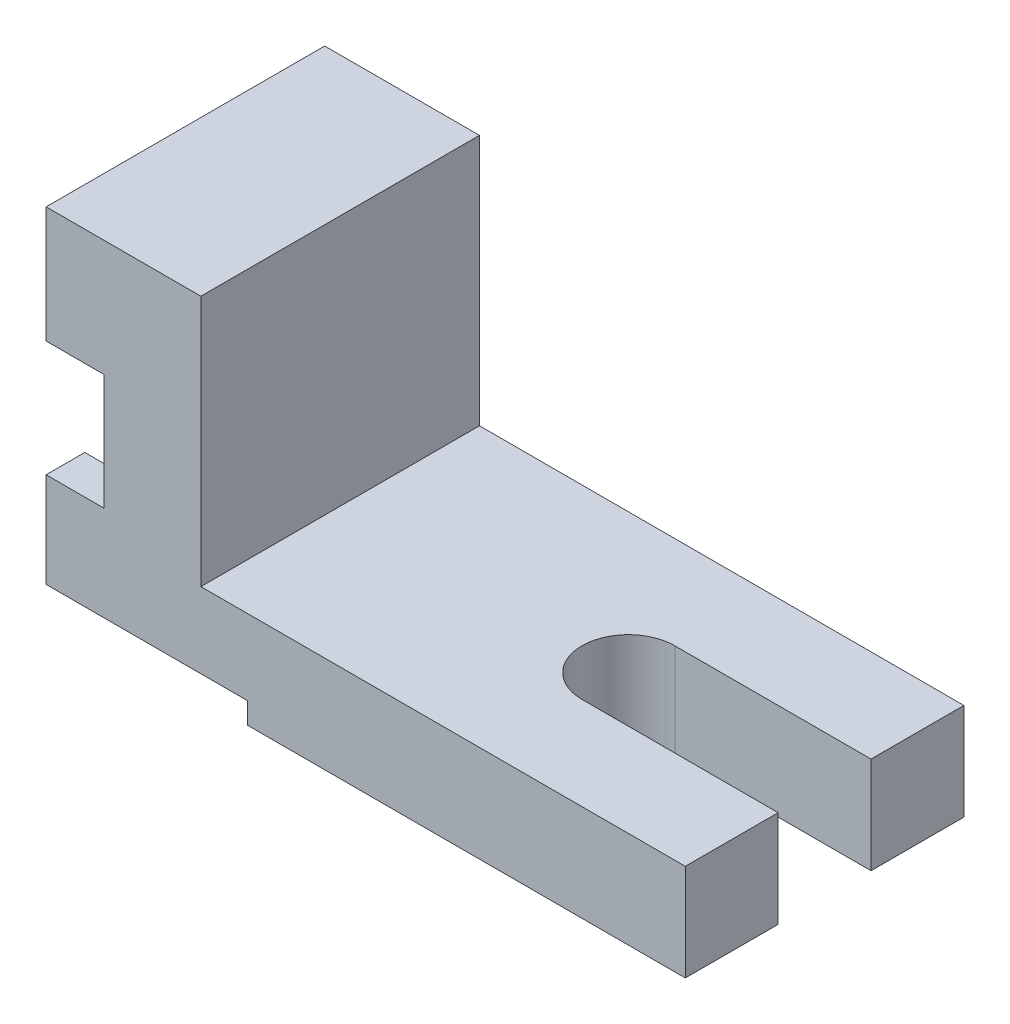
ISO-10303-21;
HEADER;
FILE_DESCRIPTION(('STEP AP214'),'2;1');
FILE_NAME('part.step','',(''),(''),'','','');
FILE_SCHEMA(('AUTOMOTIVE_DESIGN { 1 0 10303 214 1 1 1 1 }'));
ENDSEC;
DATA;
#1=APPLICATION_CONTEXT('core data for automotive mechanical design processes');
#2=APPLICATION_PROTOCOL_DEFINITION('international standard','automotive_design',2000,#1);
#3=PRODUCT_CONTEXT('',#1,'mechanical');
#4=PRODUCT('Part','Part','',(#3));
#5=PRODUCT_RELATED_PRODUCT_CATEGORY('part','',(#4));
#6=PRODUCT_DEFINITION_FORMATION('','',#4);
#7=PRODUCT_DEFINITION_CONTEXT('part definition',#1,'design');
#8=PRODUCT_DEFINITION('design','',#6,#7);
#9=PRODUCT_DEFINITION_SHAPE('','',#8);
#10=(LENGTH_UNIT() NAMED_UNIT(*) SI_UNIT(.MILLI.,.METRE.));
#11=(NAMED_UNIT(*) PLANE_ANGLE_UNIT() SI_UNIT($,.RADIAN.));
#12=(NAMED_UNIT(*) SI_UNIT($,.STERADIAN.) SOLID_ANGLE_UNIT());
#13=UNCERTAINTY_MEASURE_WITH_UNIT(LENGTH_MEASURE(1.E-05),#10,'distance_accuracy_value','');
#14=(GEOMETRIC_REPRESENTATION_CONTEXT(3) GLOBAL_UNCERTAINTY_ASSIGNED_CONTEXT((#13)) GLOBAL_UNIT_ASSIGNED_CONTEXT((#10,
#11,#12)) REPRESENTATION_CONTEXT('',''));
#15=CARTESIAN_POINT('',(0.,0.,0.));
#16=DIRECTION('',(0.,0.,1.));
#17=DIRECTION('',(1.,0.,0.));
#18=AXIS2_PLACEMENT_3D('',#15,#16,#17);
#19=CARTESIAN_POINT('',(-25.,0.,0.));
#20=DIRECTION('',(1.,0.,0.));
#21=DIRECTION('',(0.,0.,-1.));
#22=AXIS2_PLACEMENT_3D('',#19,#20,#21);
#23=PLANE('',#22);
#24=DIRECTION('',(0.,0.,1.));
#25=VECTOR('',#24,1.);
#26=CARTESIAN_POINT('',(-25.,59.9666295470957,-72.));
#27=LINE('',#26,#25);
#28=CARTESIAN_POINT('',(-25.,59.9666295470957,-72.));
#29=VERTEX_POINT('',#28);
#30=CARTESIAN_POINT('',(-25.,59.9666295470957,-62.));
#31=VERTEX_POINT('',#30);
#32=EDGE_CURVE('E255',#29,#31,#27,.T.);
#33=ORIENTED_EDGE('',*,*,#32,.F.);
#34=DIRECTION('',(0.,-1.,0.));
#35=VECTOR('',#34,1.);
#36=CARTESIAN_POINT('',(-25.,0.,-72.));
#37=LINE('',#36,#35);
#38=CARTESIAN_POINT('',(-25.,30.0333704529043,-72.));
#39=VERTEX_POINT('',#38);
#40=EDGE_CURVE('E305',#29,#39,#37,.T.);
#41=ORIENTED_EDGE('',*,*,#40,.T.);
#42=DIRECTION('',(0.,0.,-1.));
#43=VECTOR('',#42,1.);
#44=CARTESIAN_POINT('',(-25.,30.0333704529043,-72.));
#45=LINE('',#44,#43);
#46=CARTESIAN_POINT('',(-25.,30.0333704529043,-62.));
#47=VERTEX_POINT('',#46);
#48=EDGE_CURVE('E224',#47,#39,#45,.T.);
#49=ORIENTED_EDGE('',*,*,#48,.F.);
#50=CARTESIAN_POINT('',(-25.,45.,-36.));
#51=DIRECTION('',(1.,0.,0.));
#52=DIRECTION('',(0.,0.,1.));
#53=AXIS2_PLACEMENT_3D('',#50,#51,#52);
#54=CIRCLE('',#53,30.);
#55=CARTESIAN_POINT('',(-25.,30.0333704529042,-10.));
#56=VERTEX_POINT('',#55);
#57=EDGE_CURVE('E254',#56,#47,#54,.T.);
#58=ORIENTED_EDGE('',*,*,#57,.F.);
#59=DIRECTION('',(0.,0.,-1.));
#60=VECTOR('',#59,1.);
#61=CARTESIAN_POINT('',(-25.,30.0333704529042,0.));
#62=LINE('',#61,#60);
#63=CARTESIAN_POINT('',(-25.,30.0333704529042,0.));
#64=VERTEX_POINT('',#63);
#65=EDGE_CURVE('E250',#64,#56,#62,.T.);
#66=ORIENTED_EDGE('',*,*,#65,.F.);
#67=DIRECTION('',(0.,1.,0.));
#68=VECTOR('',#67,1.);
#69=CARTESIAN_POINT('',(-25.,90.,0.));
#70=LINE('',#69,#68);
#71=CARTESIAN_POINT('',(-25.,59.9666295470957,0.));
#72=VERTEX_POINT('',#71);
#73=EDGE_CURVE('E302',#64,#72,#70,.T.);
#74=ORIENTED_EDGE('',*,*,#73,.T.);
#75=DIRECTION('',(0.,0.,1.));
#76=VECTOR('',#75,1.);
#77=CARTESIAN_POINT('',(-25.,59.9666295470958,0.));
#78=LINE('',#77,#76);
#79=CARTESIAN_POINT('',(-25.,59.9666295470958,-10.));
#80=VERTEX_POINT('',#79);
#81=EDGE_CURVE('E64',#80,#72,#78,.T.);
#82=ORIENTED_EDGE('',*,*,#81,.F.);
#83=CARTESIAN_POINT('',(-25.,45.,-36.));
#84=DIRECTION('',(1.,0.,0.));
#85=DIRECTION('',(0.,0.,1.));
#86=AXIS2_PLACEMENT_3D('',#83,#84,#85);
#87=CIRCLE('',#86,30.);
#88=EDGE_CURVE('E59',#31,#80,#87,.T.);
#89=ORIENTED_EDGE('',*,*,#88,.F.);
#90=EDGE_LOOP('',(#33,#41,#49,#58,#66,#74,#82,#89));
#91=FACE_BOUND('',#90,.T.);
#92=ADVANCED_FACE('F43',(#91),#23,.F.);
#93=CARTESIAN_POINT('',(62.5979381443299,25.,0.));
#94=DIRECTION('',(0.,0.,-1.));
#95=DIRECTION('',(-1.,0.,0.));
#96=AXIS2_PLACEMENT_3D('',#93,#94,#95);
#97=PLANE('',#96);
#98=ORIENTED_EDGE('',*,*,#73,.F.);
#99=DIRECTION('',(1.,0.,0.));
#100=VECTOR('',#99,1.);
#101=CARTESIAN_POINT('',(-40.,30.0333704529042,0.));
#102=LINE('',#101,#100);
#103=CARTESIAN_POINT('',(-40.,30.0333704529042,0.));
#104=VERTEX_POINT('',#103);
#105=EDGE_CURVE('E273',#104,#64,#102,.T.);
#106=ORIENTED_EDGE('',*,*,#105,.F.);
#107=DIRECTION('',(0.,1.,0.));
#108=VECTOR('',#107,1.);
#109=CARTESIAN_POINT('',(-40.,5.48818639733899,0.));
#110=LINE('',#109,#108);
#111=CARTESIAN_POINT('',(-40.,5.48818639733899,0.));
#112=VERTEX_POINT('',#111);
#113=EDGE_CURVE('E219',#112,#104,#110,.T.);
#114=ORIENTED_EDGE('',*,*,#113,.F.);
#115=DIRECTION('',(-1.,0.,0.));
#116=VECTOR('',#115,1.);
#117=CARTESIAN_POINT('',(12.0598958251197,5.48818639733899,0.));
#118=LINE('',#117,#116);
#119=CARTESIAN_POINT('',(12.0598958251197,5.48818639733899,0.));
#120=VERTEX_POINT('',#119);
#121=EDGE_CURVE('E283',#120,#112,#118,.T.);
#122=ORIENTED_EDGE('',*,*,#121,.F.);
#123=DIRECTION('',(0.,1.,0.));
#124=VECTOR('',#123,1.);
#125=CARTESIAN_POINT('',(12.0598958251197,0.,0.));
#126=LINE('',#125,#124);
#127=CARTESIAN_POINT('',(12.0598958251197,0.,0.));
#128=VERTEX_POINT('',#127);
#129=EDGE_CURVE('E277',#128,#120,#126,.T.);
#130=ORIENTED_EDGE('',*,*,#129,.F.);
#131=DIRECTION('',(1.,0.,0.));
#132=VECTOR('',#131,1.);
#133=CARTESIAN_POINT('',(62.5979381443299,0.,0.));
#134=LINE('',#133,#132);
#135=CARTESIAN_POINT('',(125.19587628866,0.,0.));
#136=VERTEX_POINT('',#135);
#137=EDGE_CURVE('E323',#128,#136,#134,.T.);
#138=ORIENTED_EDGE('',*,*,#137,.T.);
#139=DIRECTION('',(0.,-1.,0.));
#140=VECTOR('',#139,1.);
#141=CARTESIAN_POINT('',(125.19587628866,25.,0.));
#142=LINE('',#141,#140);
#143=CARTESIAN_POINT('',(125.19587628866,25.,0.));
#144=VERTEX_POINT('',#143);
#145=EDGE_CURVE('E11',#144,#136,#142,.T.);
#146=ORIENTED_EDGE('',*,*,#145,.F.);
#147=DIRECTION('',(1.,0.,0.));
#148=VECTOR('',#147,1.);
#149=CARTESIAN_POINT('',(0.,25.,0.));
#150=LINE('',#149,#148);
#151=CARTESIAN_POINT('',(0.,25.,0.));
#152=VERTEX_POINT('',#151);
#153=EDGE_CURVE('E328',#152,#144,#150,.T.);
#154=ORIENTED_EDGE('',*,*,#153,.F.);
#155=DIRECTION('',(0.,1.,0.));
#156=VECTOR('',#155,1.);
#157=CARTESIAN_POINT('',(0.,90.,0.));
#158=LINE('',#157,#156);
#159=CARTESIAN_POINT('',(0.,90.,0.));
#160=VERTEX_POINT('',#159);
#161=EDGE_CURVE('E299',#152,#160,#158,.T.);
#162=ORIENTED_EDGE('',*,*,#161,.T.);
#163=DIRECTION('',(1.,0.,0.));
#164=VECTOR('',#163,1.);
#165=CARTESIAN_POINT('',(-25.,90.,0.));
#166=LINE('',#165,#164);
#167=CARTESIAN_POINT('',(-40.,90.,0.));
#168=VERTEX_POINT('',#167);
#169=EDGE_CURVE('E208',#168,#160,#166,.T.);
#170=ORIENTED_EDGE('',*,*,#169,.F.);
#171=DIRECTION('',(0.,1.,0.));
#172=VECTOR('',#171,1.);
#173=CARTESIAN_POINT('',(-40.,84.511813602661,0.));
#174=LINE('',#173,#172);
#175=CARTESIAN_POINT('',(-40.,59.9666295470958,0.));
#176=VERTEX_POINT('',#175);
#177=EDGE_CURVE('E190',#176,#168,#174,.T.);
#178=ORIENTED_EDGE('',*,*,#177,.F.);
#179=DIRECTION('',(1.,0.,0.));
#180=VECTOR('',#179,1.);
#181=CARTESIAN_POINT('',(-40.,59.9666295470958,0.));
#182=LINE('',#181,#180);
#183=EDGE_CURVE('E198',#176,#72,#182,.T.);
#184=ORIENTED_EDGE('',*,*,#183,.T.);
#185=EDGE_LOOP('',(#98,#106,#114,#122,#130,#138,#146,#154,#162,#170,#178,#184));
#186=FACE_BOUND('',#185,.T.);
#187=ADVANCED_FACE('F45',(#186),#97,.F.);
#188=CARTESIAN_POINT('',(125.19587628866,25.,0.));
#189=DIRECTION('',(-1.,0.,0.));
#190=DIRECTION('',(0.,0.,1.));
#191=AXIS2_PLACEMENT_3D('',#188,#189,#190);
#192=PLANE('',#191);
#193=DIRECTION('',(0.,0.,-1.));
#194=VECTOR('',#193,1.);
#195=CARTESIAN_POINT('',(125.19587628866,0.,0.));
#196=LINE('',#195,#194);
#197=CARTESIAN_POINT('',(125.19587628866,0.,-24.));
#198=VERTEX_POINT('',#197);
#199=EDGE_CURVE('E354',#136,#198,#196,.T.);
#200=ORIENTED_EDGE('',*,*,#199,.T.);
#201=DIRECTION('',(0.,-1.,0.));
#202=VECTOR('',#201,1.);
#203=CARTESIAN_POINT('',(125.19587628866,25.,-24.));
#204=LINE('',#203,#202);
#205=CARTESIAN_POINT('',(125.19587628866,25.,-24.));
#206=VERTEX_POINT('',#205);
#207=EDGE_CURVE('E52',#206,#198,#204,.T.);
#208=ORIENTED_EDGE('',*,*,#207,.F.);
#209=DIRECTION('',(0.,0.,-1.));
#210=VECTOR('',#209,1.);
#211=CARTESIAN_POINT('',(125.19587628866,25.,0.));
#212=LINE('',#211,#210);
#213=EDGE_CURVE('E332',#144,#206,#212,.T.);
#214=ORIENTED_EDGE('',*,*,#213,.F.);
#215=ORIENTED_EDGE('',*,*,#145,.T.);
#216=EDGE_LOOP('',(#200,#208,#214,#215));
#217=FACE_BOUND('',#216,.T.);
#218=ADVANCED_FACE('F416',(#217),#192,.F.);
#219=CARTESIAN_POINT('',(125.19587628866,25.,-24.));
#220=DIRECTION('',(0.,0.,1.));
#221=DIRECTION('',(1.,0.,0.));
#222=AXIS2_PLACEMENT_3D('',#219,#220,#221);
#223=PLANE('',#222);
#224=DIRECTION('',(-1.,0.,0.));
#225=VECTOR('',#224,1.);
#226=CARTESIAN_POINT('',(125.19587628866,0.,-24.));
#227=LINE('',#226,#225);
#228=CARTESIAN_POINT('',(74.4742268041237,0.,-24.));
#229=VERTEX_POINT('',#228);
#230=EDGE_CURVE('E357',#198,#229,#227,.T.);
#231=ORIENTED_EDGE('',*,*,#230,.T.);
#232=DIRECTION('',(0.,-1.,0.));
#233=VECTOR('',#232,1.);
#234=CARTESIAN_POINT('',(74.4742268041237,25.,-24.));
#235=LINE('',#234,#233);
#236=CARTESIAN_POINT('',(74.4742268041237,25.,-24.));
#237=VERTEX_POINT('',#236);
#238=EDGE_CURVE('E382',#237,#229,#235,.T.);
#239=ORIENTED_EDGE('',*,*,#238,.F.);
#240=DIRECTION('',(-1.,0.,0.));
#241=VECTOR('',#240,1.);
#242=CARTESIAN_POINT('',(125.19587628866,25.,-24.));
#243=LINE('',#242,#241);
#244=EDGE_CURVE('E335',#206,#237,#243,.T.);
#245=ORIENTED_EDGE('',*,*,#244,.F.);
#246=ORIENTED_EDGE('',*,*,#207,.T.);
#247=EDGE_LOOP('',(#231,#239,#245,#246));
#248=FACE_BOUND('',#247,.T.);
#249=ADVANCED_FACE('F391',(#248),#223,.F.);
#250=CARTESIAN_POINT('',(74.4742268041237,25.,-36.));
#251=DIRECTION('',(0.,-1.,0.));
#252=DIRECTION('',(0.,0.,-1.));
#253=AXIS2_PLACEMENT_3D('',#250,#251,#252);
#254=CYLINDRICAL_SURFACE('',#253,12.);
#255=CARTESIAN_POINT('',(74.4742268041237,0.,-36.));
#256=DIRECTION('',(0.,-1.,0.));
#257=DIRECTION('',(0.,0.,1.));
#258=AXIS2_PLACEMENT_3D('',#255,#256,#257);
#259=CIRCLE('',#258,12.);
#260=CARTESIAN_POINT('',(74.4742268041237,0.,-48.));
#261=VERTEX_POINT('',#260);
#262=EDGE_CURVE('E360',#229,#261,#259,.T.);
#263=ORIENTED_EDGE('',*,*,#262,.T.);
#264=DIRECTION('',(0.,-1.,0.));
#265=VECTOR('',#264,1.);
#266=CARTESIAN_POINT('',(74.4742268041237,25.,-48.));
#267=LINE('',#266,#265);
#268=CARTESIAN_POINT('',(74.4742268041237,25.,-48.));
#269=VERTEX_POINT('',#268);
#270=EDGE_CURVE('E378',#269,#261,#267,.T.);
#271=ORIENTED_EDGE('',*,*,#270,.F.);
#272=CARTESIAN_POINT('',(74.4742268041237,25.,-36.));
#273=DIRECTION('',(0.,-1.,0.));
#274=DIRECTION('',(0.,0.,1.));
#275=AXIS2_PLACEMENT_3D('',#272,#273,#274);
#276=CIRCLE('',#275,12.);
#277=EDGE_CURVE('E338',#237,#269,#276,.T.);
#278=ORIENTED_EDGE('',*,*,#277,.F.);
#279=ORIENTED_EDGE('',*,*,#238,.T.);
#280=EDGE_LOOP('',(#263,#271,#278,#279));
#281=FACE_BOUND('',#280,.T.);
#282=ADVANCED_FACE('F404',(#281),#254,.F.);
#283=CARTESIAN_POINT('',(74.4742268041237,25.,-48.));
#284=DIRECTION('',(0.,0.,-1.));
#285=DIRECTION('',(-1.,0.,0.));
#286=AXIS2_PLACEMENT_3D('',#283,#284,#285);
#287=PLANE('',#286);
#288=DIRECTION('',(1.,0.,0.));
#289=VECTOR('',#288,1.);
#290=CARTESIAN_POINT('',(74.4742268041237,0.,-48.));
#291=LINE('',#290,#289);
#292=CARTESIAN_POINT('',(125.19587628866,0.,-48.));
#293=VERTEX_POINT('',#292);
#294=EDGE_CURVE('E363',#261,#293,#291,.T.);
#295=ORIENTED_EDGE('',*,*,#294,.T.);
#296=DIRECTION('',(0.,-1.,0.));
#297=VECTOR('',#296,1.);
#298=CARTESIAN_POINT('',(125.19587628866,25.,-48.));
#299=LINE('',#298,#297);
#300=CARTESIAN_POINT('',(125.19587628866,25.,-48.));
#301=VERTEX_POINT('',#300);
#302=EDGE_CURVE('E374',#301,#293,#299,.T.);
#303=ORIENTED_EDGE('',*,*,#302,.F.);
#304=DIRECTION('',(1.,0.,0.));
#305=VECTOR('',#304,1.);
#306=CARTESIAN_POINT('',(74.4742268041237,25.,-48.));
#307=LINE('',#306,#305);
#308=EDGE_CURVE('E341',#269,#301,#307,.T.);
#309=ORIENTED_EDGE('',*,*,#308,.F.);
#310=ORIENTED_EDGE('',*,*,#270,.T.);
#311=EDGE_LOOP('',(#295,#303,#309,#310));
#312=FACE_BOUND('',#311,.T.);
#313=ADVANCED_FACE('F408',(#312),#287,.F.);
#314=CARTESIAN_POINT('',(125.19587628866,25.,-48.));
#315=DIRECTION('',(-1.,0.,0.));
#316=DIRECTION('',(0.,0.,1.));
#317=AXIS2_PLACEMENT_3D('',#314,#315,#316);
#318=PLANE('',#317);
#319=DIRECTION('',(0.,0.,-1.));
#320=VECTOR('',#319,1.);
#321=CARTESIAN_POINT('',(125.19587628866,0.,-48.));
#322=LINE('',#321,#320);
#323=CARTESIAN_POINT('',(125.19587628866,0.,-72.));
#324=VERTEX_POINT('',#323);
#325=EDGE_CURVE('E366',#293,#324,#322,.T.);
#326=ORIENTED_EDGE('',*,*,#325,.T.);
#327=DIRECTION('',(0.,-1.,0.));
#328=VECTOR('',#327,1.);
#329=CARTESIAN_POINT('',(125.19587628866,25.,-72.));
#330=LINE('',#329,#328);
#331=CARTESIAN_POINT('',(125.19587628866,25.,-72.));
#332=VERTEX_POINT('',#331);
#333=EDGE_CURVE('E351',#332,#324,#330,.T.);
#334=ORIENTED_EDGE('',*,*,#333,.F.);
#335=DIRECTION('',(0.,0.,-1.));
#336=VECTOR('',#335,1.);
#337=CARTESIAN_POINT('',(125.19587628866,25.,-48.));
#338=LINE('',#337,#336);
#339=EDGE_CURVE('E344',#301,#332,#338,.T.);
#340=ORIENTED_EDGE('',*,*,#339,.F.);
#341=ORIENTED_EDGE('',*,*,#302,.T.);
#342=EDGE_LOOP('',(#326,#334,#340,#341));
#343=FACE_BOUND('',#342,.T.);
#344=ADVANCED_FACE('F451',(#343),#318,.F.);
#345=CARTESIAN_POINT('',(125.19587628866,25.,-72.));
#346=DIRECTION('',(0.,0.,1.));
#347=DIRECTION('',(1.,0.,0.));
#348=AXIS2_PLACEMENT_3D('',#345,#346,#347);
#349=PLANE('',#348);
#350=DIRECTION('',(-1.,0.,0.));
#351=VECTOR('',#350,1.);
#352=CARTESIAN_POINT('',(125.19587628866,0.,-72.));
#353=LINE('',#352,#351);
#354=CARTESIAN_POINT('',(-40.,0.,-72.));
#355=VERTEX_POINT('',#354);
#356=EDGE_CURVE('E329',#324,#355,#353,.T.);
#357=ORIENTED_EDGE('',*,*,#356,.T.);
#358=DIRECTION('',(0.,-1.,0.));
#359=VECTOR('',#358,1.);
#360=CARTESIAN_POINT('',(-40.,0.,-72.));
#361=LINE('',#360,#359);
#362=CARTESIAN_POINT('',(-40.,30.0333704529043,-72.));
#363=VERTEX_POINT('',#362);
#364=EDGE_CURVE('E233',#363,#355,#361,.T.);
#365=ORIENTED_EDGE('',*,*,#364,.F.);
#366=DIRECTION('',(1.,0.,0.));
#367=VECTOR('',#366,1.);
#368=CARTESIAN_POINT('',(-40.,30.0333704529043,-72.));
#369=LINE('',#368,#367);
#370=EDGE_CURVE('E249',#363,#39,#369,.T.);
#371=ORIENTED_EDGE('',*,*,#370,.T.);
#372=ORIENTED_EDGE('',*,*,#40,.F.);
#373=DIRECTION('',(1.,0.,0.));
#374=VECTOR('',#373,1.);
#375=CARTESIAN_POINT('',(-40.,59.9666295470957,-72.));
#376=LINE('',#375,#374);
#377=CARTESIAN_POINT('',(-40.,59.9666295470957,-72.));
#378=VERTEX_POINT('',#377);
#379=EDGE_CURVE('E738',#378,#29,#376,.T.);
#380=ORIENTED_EDGE('',*,*,#379,.F.);
#381=DIRECTION('',(0.,-1.,0.));
#382=VECTOR('',#381,1.);
#383=CARTESIAN_POINT('',(-40.,90.,-72.));
#384=LINE('',#383,#382);
#385=CARTESIAN_POINT('',(-40.,90.,-72.));
#386=VERTEX_POINT('',#385);
#387=EDGE_CURVE('E215',#386,#378,#384,.T.);
#388=ORIENTED_EDGE('',*,*,#387,.F.);
#389=DIRECTION('',(1.,0.,0.));
#390=VECTOR('',#389,1.);
#391=CARTESIAN_POINT('',(-25.,90.,-72.));
#392=LINE('',#391,#390);
#393=CARTESIAN_POINT('',(0.,90.,-72.));
#394=VERTEX_POINT('',#393);
#395=EDGE_CURVE('E309',#386,#394,#392,.T.);
#396=ORIENTED_EDGE('',*,*,#395,.T.);
#397=DIRECTION('',(0.,-1.,0.));
#398=VECTOR('',#397,1.);
#399=CARTESIAN_POINT('',(0.,0.,-72.));
#400=LINE('',#399,#398);
#401=CARTESIAN_POINT('',(0.,25.,-72.));
#402=VERTEX_POINT('',#401);
#403=EDGE_CURVE('E306',#394,#402,#400,.T.);
#404=ORIENTED_EDGE('',*,*,#403,.T.);
#405=DIRECTION('',(-1.,0.,0.));
#406=VECTOR('',#405,1.);
#407=CARTESIAN_POINT('',(125.19587628866,25.,-72.));
#408=LINE('',#407,#406);
#409=EDGE_CURVE('E347',#332,#402,#408,.T.);
#410=ORIENTED_EDGE('',*,*,#409,.F.);
#411=ORIENTED_EDGE('',*,*,#333,.T.);
#412=EDGE_LOOP('',(#357,#365,#371,#372,#380,#388,#396,#404,#410,#411));
#413=FACE_BOUND('',#412,.T.);
#414=ADVANCED_FACE('F448',(#413),#349,.F.);
#415=CARTESIAN_POINT('',(74.4742268041237,25.,-36.));
#416=DIRECTION('',(0.,1.,0.));
#417=DIRECTION('',(0.,0.,1.));
#418=AXIS2_PLACEMENT_3D('',#415,#416,#417);
#419=PLANE('',#418);
#420=DIRECTION('',(0.,0.,1.));
#421=VECTOR('',#420,1.);
#422=CARTESIAN_POINT('',(0.,25.,-72.));
#423=LINE('',#422,#421);
#424=EDGE_CURVE('E324',#402,#152,#423,.T.);
#425=ORIENTED_EDGE('',*,*,#424,.T.);
#426=ORIENTED_EDGE('',*,*,#153,.T.);
#427=ORIENTED_EDGE('',*,*,#213,.T.);
#428=ORIENTED_EDGE('',*,*,#244,.T.);
#429=ORIENTED_EDGE('',*,*,#277,.T.);
#430=ORIENTED_EDGE('',*,*,#308,.T.);
#431=ORIENTED_EDGE('',*,*,#339,.T.);
#432=ORIENTED_EDGE('',*,*,#409,.T.);
#433=EDGE_LOOP('',(#425,#426,#427,#428,#429,#430,#431,#432));
#434=FACE_BOUND('',#433,.T.);
#435=ADVANCED_FACE('F412',(#434),#419,.T.);
#436=CARTESIAN_POINT('',(74.4742268041237,0.,-36.));
#437=DIRECTION('',(0.,1.,0.));
#438=DIRECTION('',(0.,0.,1.));
#439=AXIS2_PLACEMENT_3D('',#436,#437,#438);
#440=PLANE('',#439);
#441=ORIENTED_EDGE('',*,*,#137,.F.);
#442=DIRECTION('',(0.,0.,1.));
#443=VECTOR('',#442,1.);
#444=CARTESIAN_POINT('',(12.0598958251197,0.,-50.));
#445=LINE('',#444,#443);
#446=CARTESIAN_POINT('',(12.0598958251197,0.,-50.));
#447=VERTEX_POINT('',#446);
#448=EDGE_CURVE('E290',#447,#128,#445,.T.);
#449=ORIENTED_EDGE('',*,*,#448,.F.);
#450=DIRECTION('',(1.,0.,0.));
#451=VECTOR('',#450,1.);
#452=CARTESIAN_POINT('',(-25.,0.,-50.));
#453=LINE('',#452,#451);
#454=CARTESIAN_POINT('',(-40.,0.,-50.));
#455=VERTEX_POINT('',#454);
#456=EDGE_CURVE('E278',#455,#447,#453,.T.);
#457=ORIENTED_EDGE('',*,*,#456,.F.);
#458=DIRECTION('',(0.,0.,1.));
#459=VECTOR('',#458,1.);
#460=CARTESIAN_POINT('',(-40.,0.,-50.));
#461=LINE('',#460,#459);
#462=EDGE_CURVE('E237',#355,#455,#461,.T.);
#463=ORIENTED_EDGE('',*,*,#462,.F.);
#464=ORIENTED_EDGE('',*,*,#356,.F.);
#465=ORIENTED_EDGE('',*,*,#325,.F.);
#466=ORIENTED_EDGE('',*,*,#294,.F.);
#467=ORIENTED_EDGE('',*,*,#262,.F.);
#468=ORIENTED_EDGE('',*,*,#230,.F.);
#469=ORIENTED_EDGE('',*,*,#199,.F.);
#470=EDGE_LOOP('',(#441,#449,#457,#463,#464,#465,#466,#467,#468,#469));
#471=FACE_BOUND('',#470,.T.);
#472=ADVANCED_FACE('F399',(#471),#440,.F.);
#473=CARTESIAN_POINT('',(0.,0.,0.));
#474=DIRECTION('',(1.,0.,0.));
#475=DIRECTION('',(0.,0.,-1.));
#476=AXIS2_PLACEMENT_3D('',#473,#474,#475);
#477=PLANE('',#476);
#478=ORIENTED_EDGE('',*,*,#424,.F.);
#479=ORIENTED_EDGE('',*,*,#403,.F.);
#480=DIRECTION('',(0.,0.,-1.));
#481=VECTOR('',#480,1.);
#482=CARTESIAN_POINT('',(0.,90.,-72.));
#483=LINE('',#482,#481);
#484=EDGE_CURVE('E312',#160,#394,#483,.T.);
#485=ORIENTED_EDGE('',*,*,#484,.F.);
#486=ORIENTED_EDGE('',*,*,#161,.F.);
#487=EDGE_LOOP('',(#478,#479,#485,#486));
#488=FACE_BOUND('',#487,.T.);
#489=ADVANCED_FACE('F468',(#488),#477,.T.);
#490=CARTESIAN_POINT('',(-25.,90.,-72.));
#491=DIRECTION('',(0.,-1.,0.));
#492=DIRECTION('',(0.,0.,-1.));
#493=AXIS2_PLACEMENT_3D('',#490,#491,#492);
#494=PLANE('',#493);
#495=ORIENTED_EDGE('',*,*,#484,.T.);
#496=ORIENTED_EDGE('',*,*,#395,.F.);
#497=DIRECTION('',(0.,0.,-1.));
#498=VECTOR('',#497,1.);
#499=CARTESIAN_POINT('',(-40.,90.,-50.));
#500=LINE('',#499,#498);
#501=EDGE_CURVE('E210',#168,#386,#500,.T.);
#502=ORIENTED_EDGE('',*,*,#501,.F.);
#503=ORIENTED_EDGE('',*,*,#169,.T.);
#504=EDGE_LOOP('',(#495,#496,#502,#503));
#505=FACE_BOUND('',#504,.T.);
#506=ADVANCED_FACE('F471',(#505),#494,.F.);
#507=CARTESIAN_POINT('',(12.0598958251197,5.48818639733899,-50.));
#508=DIRECTION('',(0.,1.,0.));
#509=DIRECTION('',(-1.,0.,0.));
#510=AXIS2_PLACEMENT_3D('',#507,#508,#509);
#511=PLANE('',#510);
#512=ORIENTED_EDGE('',*,*,#121,.T.);
#513=DIRECTION('',(0.,0.,1.));
#514=VECTOR('',#513,1.);
#515=CARTESIAN_POINT('',(-40.,5.48818639733899,0.));
#516=LINE('',#515,#514);
#517=CARTESIAN_POINT('',(-40.,5.48818639733899,-50.));
#518=VERTEX_POINT('',#517);
#519=EDGE_CURVE('E245',#518,#112,#516,.T.);
#520=ORIENTED_EDGE('',*,*,#519,.F.);
#521=DIRECTION('',(-1.,0.,0.));
#522=VECTOR('',#521,1.);
#523=CARTESIAN_POINT('',(12.0598958251197,5.48818639733899,-50.));
#524=LINE('',#523,#522);
#525=CARTESIAN_POINT('',(12.0598958251197,5.48818639733899,-50.));
#526=VERTEX_POINT('',#525);
#527=EDGE_CURVE('E287',#526,#518,#524,.T.);
#528=ORIENTED_EDGE('',*,*,#527,.F.);
#529=DIRECTION('',(0.,0.,1.));
#530=VECTOR('',#529,1.);
#531=CARTESIAN_POINT('',(12.0598958251197,5.48818639733899,-50.));
#532=LINE('',#531,#530);
#533=EDGE_CURVE('E296',#526,#120,#532,.T.);
#534=ORIENTED_EDGE('',*,*,#533,.T.);
#535=EDGE_LOOP('',(#512,#520,#528,#534));
#536=FACE_BOUND('',#535,.T.);
#537=ADVANCED_FACE('F432',(#536),#511,.F.);
#538=CARTESIAN_POINT('',(12.0598958251197,0.,-50.));
#539=DIRECTION('',(1.,0.,0.));
#540=DIRECTION('',(0.,0.,-1.));
#541=AXIS2_PLACEMENT_3D('',#538,#539,#540);
#542=PLANE('',#541);
#543=ORIENTED_EDGE('',*,*,#129,.T.);
#544=ORIENTED_EDGE('',*,*,#533,.F.);
#545=DIRECTION('',(0.,1.,0.));
#546=VECTOR('',#545,1.);
#547=CARTESIAN_POINT('',(12.0598958251197,0.,-50.));
#548=LINE('',#547,#546);
#549=EDGE_CURVE('E282',#447,#526,#548,.T.);
#550=ORIENTED_EDGE('',*,*,#549,.F.);
#551=ORIENTED_EDGE('',*,*,#448,.T.);
#552=EDGE_LOOP('',(#543,#544,#550,#551));
#553=FACE_BOUND('',#552,.T.);
#554=ADVANCED_FACE('F422',(#553),#542,.F.);
#555=CARTESIAN_POINT('',(0.,0.,-50.));
#556=DIRECTION('',(0.,0.,1.));
#557=DIRECTION('',(1.,0.,0.));
#558=AXIS2_PLACEMENT_3D('',#555,#556,#557);
#559=PLANE('',#558);
#560=ORIENTED_EDGE('',*,*,#456,.T.);
#561=ORIENTED_EDGE('',*,*,#549,.T.);
#562=ORIENTED_EDGE('',*,*,#527,.T.);
#563=DIRECTION('',(0.,1.,0.));
#564=VECTOR('',#563,1.);
#565=CARTESIAN_POINT('',(-40.,5.48818639733899,-50.));
#566=LINE('',#565,#564);
#567=EDGE_CURVE('E241',#455,#518,#566,.T.);
#568=ORIENTED_EDGE('',*,*,#567,.F.);
#569=EDGE_LOOP('',(#560,#561,#562,#568));
#570=FACE_BOUND('',#569,.T.);
#571=ADVANCED_FACE('F426',(#570),#559,.T.);
#572=CARTESIAN_POINT('',(-40.,30.0333704529042,0.));
#573=DIRECTION('',(0.,-1.,0.));
#574=DIRECTION('',(0.,0.,-1.));
#575=AXIS2_PLACEMENT_3D('',#572,#573,#574);
#576=PLANE('',#575);
#577=ORIENTED_EDGE('',*,*,#65,.T.);
#578=DIRECTION('',(1.,0.,0.));
#579=VECTOR('',#578,1.);
#580=CARTESIAN_POINT('',(-40.,30.0333704529042,-10.));
#581=LINE('',#580,#579);
#582=CARTESIAN_POINT('',(-40.,30.0333704529042,-10.));
#583=VERTEX_POINT('',#582);
#584=EDGE_CURVE('E269',#583,#56,#581,.T.);
#585=ORIENTED_EDGE('',*,*,#584,.F.);
#586=DIRECTION('',(0.,0.,-1.));
#587=VECTOR('',#586,1.);
#588=CARTESIAN_POINT('',(-40.,30.0333704529042,0.));
#589=LINE('',#588,#587);
#590=EDGE_CURVE('E223',#104,#583,#589,.T.);
#591=ORIENTED_EDGE('',*,*,#590,.F.);
#592=ORIENTED_EDGE('',*,*,#105,.T.);
#593=EDGE_LOOP('',(#577,#585,#591,#592));
#594=FACE_BOUND('',#593,.T.);
#595=ADVANCED_FACE('F438',(#594),#576,.F.);
#596=CARTESIAN_POINT('',(-40.,45.,-36.));
#597=DIRECTION('',(1.,0.,0.));
#598=DIRECTION('',(0.,0.,-1.));
#599=AXIS2_PLACEMENT_3D('',#596,#597,#598);
#600=CYLINDRICAL_SURFACE('',#599,30.);
#601=ORIENTED_EDGE('',*,*,#57,.T.);
#602=DIRECTION('',(1.,0.,0.));
#603=VECTOR('',#602,1.);
#604=CARTESIAN_POINT('',(-40.,30.0333704529043,-62.));
#605=LINE('',#604,#603);
#606=CARTESIAN_POINT('',(-40.,30.0333704529043,-62.));
#607=VERTEX_POINT('',#606);
#608=EDGE_CURVE('E265',#607,#47,#605,.T.);
#609=ORIENTED_EDGE('',*,*,#608,.F.);
#610=CARTESIAN_POINT('',(-40.,45.,-36.));
#611=DIRECTION('',(1.,0.,0.));
#612=DIRECTION('',(0.,0.,1.));
#613=AXIS2_PLACEMENT_3D('',#610,#611,#612);
#614=CIRCLE('',#613,30.);
#615=EDGE_CURVE('E227',#583,#607,#614,.T.);
#616=ORIENTED_EDGE('',*,*,#615,.F.);
#617=ORIENTED_EDGE('',*,*,#584,.T.);
#618=EDGE_LOOP('',(#601,#609,#616,#617));
#619=FACE_BOUND('',#618,.T.);
#620=ADVANCED_FACE('F440',(#619),#600,.F.);
#621=CARTESIAN_POINT('',(-40.,30.0333704529043,-72.));
#622=DIRECTION('',(0.,-1.,0.));
#623=DIRECTION('',(0.,0.,-1.));
#624=AXIS2_PLACEMENT_3D('',#621,#622,#623);
#625=PLANE('',#624);
#626=ORIENTED_EDGE('',*,*,#48,.T.);
#627=ORIENTED_EDGE('',*,*,#370,.F.);
#628=DIRECTION('',(0.,0.,-1.));
#629=VECTOR('',#628,1.);
#630=CARTESIAN_POINT('',(-40.,30.0333704529043,-72.));
#631=LINE('',#630,#629);
#632=EDGE_CURVE('E230',#607,#363,#631,.T.);
#633=ORIENTED_EDGE('',*,*,#632,.F.);
#634=ORIENTED_EDGE('',*,*,#608,.T.);
#635=EDGE_LOOP('',(#626,#627,#633,#634));
#636=FACE_BOUND('',#635,.T.);
#637=ADVANCED_FACE('F444',(#636),#625,.F.);
#638=CARTESIAN_POINT('',(-40.,45.,-36.));
#639=DIRECTION('',(-1.,0.,0.));
#640=DIRECTION('',(0.,0.,1.));
#641=AXIS2_PLACEMENT_3D('',#638,#639,#640);
#642=PLANE('',#641);
#643=ORIENTED_EDGE('',*,*,#113,.T.);
#644=ORIENTED_EDGE('',*,*,#590,.T.);
#645=ORIENTED_EDGE('',*,*,#615,.T.);
#646=ORIENTED_EDGE('',*,*,#632,.T.);
#647=ORIENTED_EDGE('',*,*,#364,.T.);
#648=ORIENTED_EDGE('',*,*,#462,.T.);
#649=ORIENTED_EDGE('',*,*,#567,.T.);
#650=ORIENTED_EDGE('',*,*,#519,.T.);
#651=EDGE_LOOP('',(#643,#644,#645,#646,#647,#648,#649,#650));
#652=FACE_BOUND('',#651,.T.);
#653=ADVANCED_FACE('F429',(#652),#642,.T.);
#654=CARTESIAN_POINT('',(-40.,59.9666295470957,-72.));
#655=DIRECTION('',(0.,1.,0.));
#656=DIRECTION('',(0.,0.,1.));
#657=AXIS2_PLACEMENT_3D('',#654,#655,#656);
#658=PLANE('',#657);
#659=ORIENTED_EDGE('',*,*,#32,.T.);
#660=DIRECTION('',(1.,0.,0.));
#661=VECTOR('',#660,1.);
#662=CARTESIAN_POINT('',(-40.,59.9666295470957,-62.));
#663=LINE('',#662,#661);
#664=CARTESIAN_POINT('',(-40.,59.9666295470957,-62.));
#665=VERTEX_POINT('',#664);
#666=EDGE_CURVE('E732',#665,#31,#663,.T.);
#667=ORIENTED_EDGE('',*,*,#666,.F.);
#668=DIRECTION('',(0.,0.,1.));
#669=VECTOR('',#668,1.);
#670=CARTESIAN_POINT('',(-40.,59.9666295470957,-72.));
#671=LINE('',#670,#669);
#672=EDGE_CURVE('E746',#378,#665,#671,.T.);
#673=ORIENTED_EDGE('',*,*,#672,.F.);
#674=ORIENTED_EDGE('',*,*,#379,.T.);
#675=EDGE_LOOP('',(#659,#667,#673,#674));
#676=FACE_BOUND('',#675,.T.);
#677=ADVANCED_FACE('F532',(#676),#658,.F.);
#678=CARTESIAN_POINT('',(-40.,45.,-36.));
#679=DIRECTION('',(1.,0.,0.));
#680=DIRECTION('',(0.,0.,-1.));
#681=AXIS2_PLACEMENT_3D('',#678,#679,#680);
#682=CYLINDRICAL_SURFACE('',#681,30.);
#683=ORIENTED_EDGE('',*,*,#88,.T.);
#684=DIRECTION('',(1.,0.,0.));
#685=VECTOR('',#684,1.);
#686=CARTESIAN_POINT('',(-40.,59.9666295470958,-10.));
#687=LINE('',#686,#685);
#688=CARTESIAN_POINT('',(-40.,59.9666295470958,-10.));
#689=VERTEX_POINT('',#688);
#690=EDGE_CURVE('E205',#689,#80,#687,.T.);
#691=ORIENTED_EDGE('',*,*,#690,.F.);
#692=CARTESIAN_POINT('',(-40.,45.,-36.));
#693=DIRECTION('',(1.,0.,0.));
#694=DIRECTION('',(0.,0.,1.));
#695=AXIS2_PLACEMENT_3D('',#692,#693,#694);
#696=CIRCLE('',#695,30.);
#697=EDGE_CURVE('E193',#665,#689,#696,.T.);
#698=ORIENTED_EDGE('',*,*,#697,.F.);
#699=ORIENTED_EDGE('',*,*,#666,.T.);
#700=EDGE_LOOP('',(#683,#691,#698,#699));
#701=FACE_BOUND('',#700,.T.);
#702=ADVANCED_FACE('F539',(#701),#682,.F.);
#703=CARTESIAN_POINT('',(-40.,59.9666295470958,0.));
#704=DIRECTION('',(0.,1.,0.));
#705=DIRECTION('',(0.,0.,1.));
#706=AXIS2_PLACEMENT_3D('',#703,#704,#705);
#707=PLANE('',#706);
#708=ORIENTED_EDGE('',*,*,#81,.T.);
#709=ORIENTED_EDGE('',*,*,#183,.F.);
#710=DIRECTION('',(0.,0.,1.));
#711=VECTOR('',#710,1.);
#712=CARTESIAN_POINT('',(-40.,59.9666295470958,0.));
#713=LINE('',#712,#711);
#714=EDGE_CURVE('E185',#689,#176,#713,.T.);
#715=ORIENTED_EDGE('',*,*,#714,.F.);
#716=ORIENTED_EDGE('',*,*,#690,.T.);
#717=EDGE_LOOP('',(#708,#709,#715,#716));
#718=FACE_BOUND('',#717,.T.);
#719=ADVANCED_FACE('F201',(#718),#707,.F.);
#720=CARTESIAN_POINT('',(-40.,45.,-36.));
#721=DIRECTION('',(-1.,0.,0.));
#722=DIRECTION('',(0.,0.,1.));
#723=AXIS2_PLACEMENT_3D('',#720,#721,#722);
#724=PLANE('',#723);
#725=ORIENTED_EDGE('',*,*,#177,.T.);
#726=ORIENTED_EDGE('',*,*,#501,.T.);
#727=ORIENTED_EDGE('',*,*,#387,.T.);
#728=ORIENTED_EDGE('',*,*,#672,.T.);
#729=ORIENTED_EDGE('',*,*,#697,.T.);
#730=ORIENTED_EDGE('',*,*,#714,.T.);
#731=EDGE_LOOP('',(#725,#726,#727,#728,#729,#730));
#732=FACE_BOUND('',#731,.T.);
#733=ADVANCED_FACE('F187',(#732),#724,.T.);
#734=CLOSED_SHELL('',(#92,#187,#218,#249,#282,#313,#344,#414,#435,#472,#489,#506,#537,#554,#571,
#595,#620,#637,#653,#677,#702,#719,#733));
#735=MANIFOLD_SOLID_BREP('B2',#734);
#736=ADVANCED_BREP_SHAPE_REPRESENTATION('',(#18,#735),#14);
#737=SHAPE_DEFINITION_REPRESENTATION(#9,#736);
ENDSEC;
END-ISO-10303-21;
